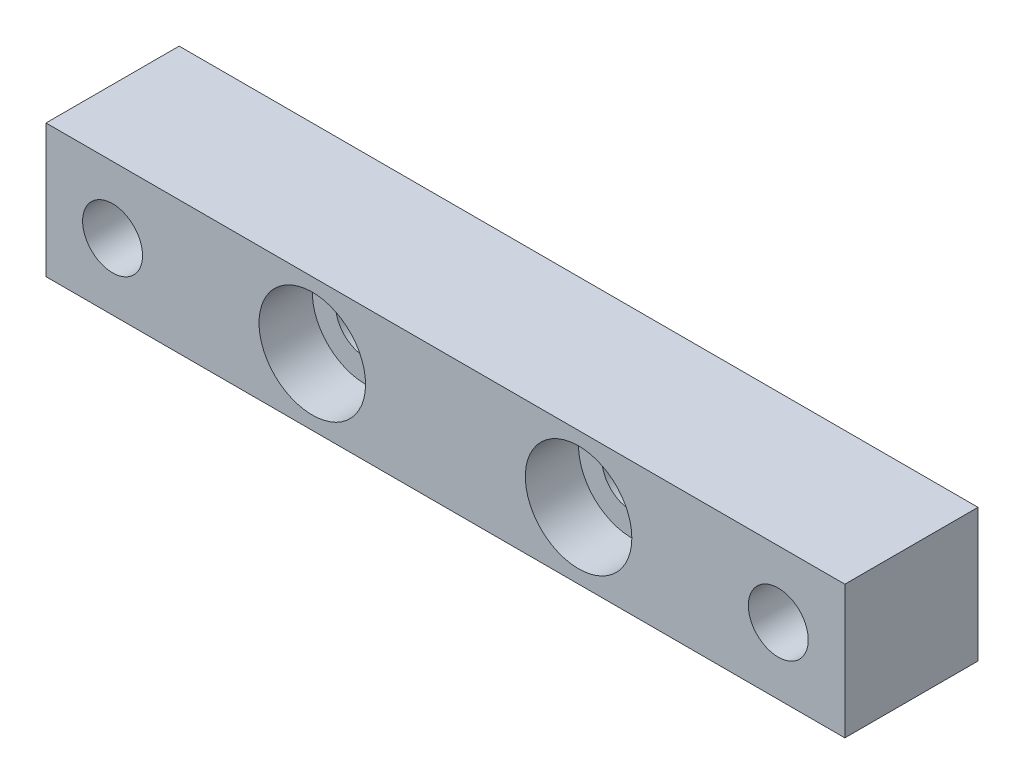
ISO-10303-21;
HEADER;
FILE_DESCRIPTION(('STEP AP214'),'2;1');
FILE_NAME('part.step','',(''),(''),'','','');
FILE_SCHEMA(('AUTOMOTIVE_DESIGN { 1 0 10303 214 1 1 1 1 }'));
ENDSEC;
DATA;
#1=APPLICATION_CONTEXT('core data for automotive mechanical design processes');
#2=APPLICATION_PROTOCOL_DEFINITION('international standard','automotive_design',2000,#1);
#3=PRODUCT_CONTEXT('',#1,'mechanical');
#4=PRODUCT('Part','Part','',(#3));
#5=PRODUCT_RELATED_PRODUCT_CATEGORY('part','',(#4));
#6=PRODUCT_DEFINITION_FORMATION('','',#4);
#7=PRODUCT_DEFINITION_CONTEXT('part definition',#1,'design');
#8=PRODUCT_DEFINITION('design','',#6,#7);
#9=PRODUCT_DEFINITION_SHAPE('','',#8);
#10=(LENGTH_UNIT() NAMED_UNIT(*) SI_UNIT(.MILLI.,.METRE.));
#11=(NAMED_UNIT(*) PLANE_ANGLE_UNIT() SI_UNIT($,.RADIAN.));
#12=(NAMED_UNIT(*) SI_UNIT($,.STERADIAN.) SOLID_ANGLE_UNIT());
#13=UNCERTAINTY_MEASURE_WITH_UNIT(LENGTH_MEASURE(1.E-05),#10,'distance_accuracy_value','');
#14=(GEOMETRIC_REPRESENTATION_CONTEXT(3) GLOBAL_UNCERTAINTY_ASSIGNED_CONTEXT((#13)) GLOBAL_UNIT_ASSIGNED_CONTEXT((#10,
#11,#12)) REPRESENTATION_CONTEXT('',''));
#15=CARTESIAN_POINT('',(0.,0.,0.));
#16=DIRECTION('',(0.,0.,1.));
#17=DIRECTION('',(1.,0.,0.));
#18=AXIS2_PLACEMENT_3D('',#15,#16,#17);
#19=CARTESIAN_POINT('',(-10.,0.,5.));
#20=DIRECTION('',(0.,0.,-1.));
#21=DIRECTION('',(-1.,0.,0.));
#22=AXIS2_PLACEMENT_3D('',#19,#20,#21);
#23=CYLINDRICAL_SURFACE('',#22,2.25);
#24=CARTESIAN_POINT('',(-10.,0.,-5.));
#25=DIRECTION('',(0.,0.,1.));
#26=DIRECTION('',(1.,0.,0.));
#27=AXIS2_PLACEMENT_3D('',#24,#25,#26);
#28=CIRCLE('',#27,2.25);
#29=CARTESIAN_POINT('',(-7.75,0.,-5.));
#30=VERTEX_POINT('',#29);
#31=EDGE_CURVE('E110',#30,#30,#28,.T.);
#32=ORIENTED_EDGE('',*,*,#31,.F.);
#33=EDGE_LOOP('',(#32));
#34=FACE_BOUND('',#33,.T.);
#35=CARTESIAN_POINT('',(-10.,0.,1.));
#36=DIRECTION('',(0.,0.,1.));
#37=DIRECTION('',(1.,0.,0.));
#38=AXIS2_PLACEMENT_3D('',#35,#36,#37);
#39=CIRCLE('',#38,2.25);
#40=CARTESIAN_POINT('',(-7.75,0.,1.));
#41=VERTEX_POINT('',#40);
#42=EDGE_CURVE('E43',#41,#41,#39,.T.);
#43=ORIENTED_EDGE('',*,*,#42,.T.);
#44=EDGE_LOOP('',(#43));
#45=FACE_BOUND('',#44,.T.);
#46=ADVANCED_FACE('F39',(#34,#45),#23,.F.);
#47=CARTESIAN_POINT('',(10.,0.,5.));
#48=DIRECTION('',(0.,0.,-1.));
#49=DIRECTION('',(-1.,0.,0.));
#50=AXIS2_PLACEMENT_3D('',#47,#48,#49);
#51=CYLINDRICAL_SURFACE('',#50,2.25);
#52=CARTESIAN_POINT('',(10.,0.,-5.));
#53=DIRECTION('',(0.,0.,1.));
#54=DIRECTION('',(1.,0.,0.));
#55=AXIS2_PLACEMENT_3D('',#52,#53,#54);
#56=CIRCLE('',#55,2.25);
#57=CARTESIAN_POINT('',(12.25,0.,-5.));
#58=VERTEX_POINT('',#57);
#59=EDGE_CURVE('E145',#58,#58,#56,.T.);
#60=ORIENTED_EDGE('',*,*,#59,.F.);
#61=EDGE_LOOP('',(#60));
#62=FACE_BOUND('',#61,.T.);
#63=CARTESIAN_POINT('',(10.,0.,1.));
#64=DIRECTION('',(0.,0.,1.));
#65=DIRECTION('',(1.,0.,0.));
#66=AXIS2_PLACEMENT_3D('',#63,#64,#65);
#67=CIRCLE('',#66,2.25);
#68=CARTESIAN_POINT('',(12.25,0.,1.));
#69=VERTEX_POINT('',#68);
#70=EDGE_CURVE('E115',#69,#69,#67,.T.);
#71=ORIENTED_EDGE('',*,*,#70,.T.);
#72=EDGE_LOOP('',(#71));
#73=FACE_BOUND('',#72,.T.);
#74=ADVANCED_FACE('F158',(#62,#73),#51,.F.);
#75=CARTESIAN_POINT('',(0.,0.,5.));
#76=DIRECTION('',(0.,0.,1.));
#77=DIRECTION('',(1.,0.,0.));
#78=AXIS2_PLACEMENT_3D('',#75,#76,#77);
#79=PLANE('',#78);
#80=CARTESIAN_POINT('',(-10.,0.,5.));
#81=DIRECTION('',(0.,0.,1.));
#82=DIRECTION('',(1.,0.,0.));
#83=AXIS2_PLACEMENT_3D('',#80,#81,#82);
#84=CIRCLE('',#83,4.);
#85=CARTESIAN_POINT('',(-6.,0.,5.));
#86=VERTEX_POINT('',#85);
#87=EDGE_CURVE('E123',#86,#86,#84,.T.);
#88=ORIENTED_EDGE('',*,*,#87,.F.);
#89=EDGE_LOOP('',(#88));
#90=FACE_BOUND('',#89,.T.);
#91=CARTESIAN_POINT('',(10.,0.,5.));
#92=DIRECTION('',(0.,0.,1.));
#93=DIRECTION('',(1.,0.,0.));
#94=AXIS2_PLACEMENT_3D('',#91,#92,#93);
#95=CIRCLE('',#94,4.);
#96=CARTESIAN_POINT('',(14.,0.,5.));
#97=VERTEX_POINT('',#96);
#98=EDGE_CURVE('E128',#97,#97,#95,.T.);
#99=ORIENTED_EDGE('',*,*,#98,.F.);
#100=EDGE_LOOP('',(#99));
#101=FACE_BOUND('',#100,.T.);
#102=CARTESIAN_POINT('',(-25.,0.,5.));
#103=DIRECTION('',(0.,0.,1.));
#104=DIRECTION('',(1.,0.,0.));
#105=AXIS2_PLACEMENT_3D('',#102,#103,#104);
#106=CIRCLE('',#105,2.25);
#107=CARTESIAN_POINT('',(-22.75,0.,5.));
#108=VERTEX_POINT('',#107);
#109=EDGE_CURVE('E142',#108,#108,#106,.T.);
#110=ORIENTED_EDGE('',*,*,#109,.F.);
#111=EDGE_LOOP('',(#110));
#112=FACE_BOUND('',#111,.T.);
#113=DIRECTION('',(0.,-1.,0.));
#114=VECTOR('',#113,1.);
#115=CARTESIAN_POINT('',(-30.,-5.,5.));
#116=LINE('',#115,#114);
#117=CARTESIAN_POINT('',(-30.,5.,5.));
#118=VERTEX_POINT('',#117);
#119=CARTESIAN_POINT('',(-30.,-5.,5.));
#120=VERTEX_POINT('',#119);
#121=EDGE_CURVE('E94',#118,#120,#116,.T.);
#122=ORIENTED_EDGE('',*,*,#121,.T.);
#123=DIRECTION('',(1.,0.,0.));
#124=VECTOR('',#123,1.);
#125=CARTESIAN_POINT('',(30.,-5.,5.));
#126=LINE('',#125,#124);
#127=CARTESIAN_POINT('',(30.,-5.,5.));
#128=VERTEX_POINT('',#127);
#129=EDGE_CURVE('E88',#120,#128,#126,.T.);
#130=ORIENTED_EDGE('',*,*,#129,.T.);
#131=DIRECTION('',(0.,1.,0.));
#132=VECTOR('',#131,1.);
#133=CARTESIAN_POINT('',(30.,-5.,5.));
#134=LINE('',#133,#132);
#135=CARTESIAN_POINT('',(30.,5.,5.));
#136=VERTEX_POINT('',#135);
#137=EDGE_CURVE('E92',#128,#136,#134,.T.);
#138=ORIENTED_EDGE('',*,*,#137,.T.);
#139=DIRECTION('',(-1.,0.,0.));
#140=VECTOR('',#139,1.);
#141=CARTESIAN_POINT('',(30.,5.,5.));
#142=LINE('',#141,#140);
#143=EDGE_CURVE('E58',#136,#118,#142,.T.);
#144=ORIENTED_EDGE('',*,*,#143,.T.);
#145=EDGE_LOOP('',(#122,#130,#138,#144));
#146=FACE_BOUND('',#145,.T.);
#147=CARTESIAN_POINT('',(25.,0.,5.));
#148=DIRECTION('',(0.,0.,1.));
#149=DIRECTION('',(-1.,0.,0.));
#150=AXIS2_PLACEMENT_3D('',#147,#148,#149);
#151=CIRCLE('',#150,2.25);
#152=CARTESIAN_POINT('',(22.75,0.,5.));
#153=VERTEX_POINT('',#152);
#154=EDGE_CURVE('E136',#153,#153,#151,.T.);
#155=ORIENTED_EDGE('',*,*,#154,.F.);
#156=EDGE_LOOP('',(#155));
#157=FACE_BOUND('',#156,.T.);
#158=ADVANCED_FACE('F89',(#90,#101,#112,#146,#157),#79,.T.);
#159=CARTESIAN_POINT('',(0.,0.,-5.));
#160=DIRECTION('',(0.,0.,1.));
#161=DIRECTION('',(1.,0.,0.));
#162=AXIS2_PLACEMENT_3D('',#159,#160,#161);
#163=PLANE('',#162);
#164=DIRECTION('',(0.,-1.,0.));
#165=VECTOR('',#164,1.);
#166=CARTESIAN_POINT('',(-30.,-5.,-5.));
#167=LINE('',#166,#165);
#168=CARTESIAN_POINT('',(-30.,5.,-5.));
#169=VERTEX_POINT('',#168);
#170=CARTESIAN_POINT('',(-30.,-5.,-5.));
#171=VERTEX_POINT('',#170);
#172=EDGE_CURVE('E107',#169,#171,#167,.T.);
#173=ORIENTED_EDGE('',*,*,#172,.F.);
#174=DIRECTION('',(-1.,0.,0.));
#175=VECTOR('',#174,1.);
#176=CARTESIAN_POINT('',(30.,5.,-5.));
#177=LINE('',#176,#175);
#178=CARTESIAN_POINT('',(30.,5.,-5.));
#179=VERTEX_POINT('',#178);
#180=EDGE_CURVE('E81',#179,#169,#177,.T.);
#181=ORIENTED_EDGE('',*,*,#180,.F.);
#182=DIRECTION('',(0.,1.,0.));
#183=VECTOR('',#182,1.);
#184=CARTESIAN_POINT('',(30.,-5.,-5.));
#185=LINE('',#184,#183);
#186=CARTESIAN_POINT('',(30.,-5.,-5.));
#187=VERTEX_POINT('',#186);
#188=EDGE_CURVE('E75',#187,#179,#185,.T.);
#189=ORIENTED_EDGE('',*,*,#188,.F.);
#190=DIRECTION('',(1.,0.,0.));
#191=VECTOR('',#190,1.);
#192=CARTESIAN_POINT('',(30.,-5.,-5.));
#193=LINE('',#192,#191);
#194=EDGE_CURVE('E98',#171,#187,#193,.T.);
#195=ORIENTED_EDGE('',*,*,#194,.F.);
#196=EDGE_LOOP('',(#173,#181,#189,#195));
#197=FACE_BOUND('',#196,.T.);
#198=ORIENTED_EDGE('',*,*,#31,.T.);
#199=EDGE_LOOP('',(#198));
#200=FACE_BOUND('',#199,.T.);
#201=ORIENTED_EDGE('',*,*,#59,.T.);
#202=EDGE_LOOP('',(#201));
#203=FACE_BOUND('',#202,.T.);
#204=CARTESIAN_POINT('',(-25.,0.,-5.));
#205=DIRECTION('',(0.,0.,1.));
#206=DIRECTION('',(1.,0.,0.));
#207=AXIS2_PLACEMENT_3D('',#204,#205,#206);
#208=CIRCLE('',#207,2.25);
#209=CARTESIAN_POINT('',(-22.75,0.,-5.));
#210=VERTEX_POINT('',#209);
#211=EDGE_CURVE('E139',#210,#210,#208,.T.);
#212=ORIENTED_EDGE('',*,*,#211,.T.);
#213=EDGE_LOOP('',(#212));
#214=FACE_BOUND('',#213,.T.);
#215=CARTESIAN_POINT('',(25.,0.,-5.));
#216=DIRECTION('',(0.,0.,1.));
#217=DIRECTION('',(-1.,0.,0.));
#218=AXIS2_PLACEMENT_3D('',#215,#216,#217);
#219=CIRCLE('',#218,2.25);
#220=CARTESIAN_POINT('',(22.75,0.,-5.));
#221=VERTEX_POINT('',#220);
#222=EDGE_CURVE('E121',#221,#221,#219,.T.);
#223=ORIENTED_EDGE('',*,*,#222,.T.);
#224=EDGE_LOOP('',(#223));
#225=FACE_BOUND('',#224,.T.);
#226=ADVANCED_FACE('F153',(#197,#200,#203,#214,#225),#163,.F.);
#227=CARTESIAN_POINT('',(-30.,-5.,5.));
#228=DIRECTION('',(1.,0.,0.));
#229=DIRECTION('',(0.,0.,-1.));
#230=AXIS2_PLACEMENT_3D('',#227,#228,#229);
#231=PLANE('',#230);
#232=ORIENTED_EDGE('',*,*,#172,.T.);
#233=DIRECTION('',(0.,0.,-1.));
#234=VECTOR('',#233,1.);
#235=CARTESIAN_POINT('',(-30.,-5.,5.));
#236=LINE('',#235,#234);
#237=EDGE_CURVE('E11',#120,#171,#236,.T.);
#238=ORIENTED_EDGE('',*,*,#237,.F.);
#239=ORIENTED_EDGE('',*,*,#121,.F.);
#240=DIRECTION('',(0.,0.,-1.));
#241=VECTOR('',#240,1.);
#242=CARTESIAN_POINT('',(-30.,5.,5.));
#243=LINE('',#242,#241);
#244=EDGE_CURVE('E103',#118,#169,#243,.T.);
#245=ORIENTED_EDGE('',*,*,#244,.T.);
#246=EDGE_LOOP('',(#232,#238,#239,#245));
#247=FACE_BOUND('',#246,.T.);
#248=ADVANCED_FACE('F41',(#247),#231,.F.);
#249=CARTESIAN_POINT('',(30.,-5.,5.));
#250=DIRECTION('',(0.,1.,0.));
#251=DIRECTION('',(0.,0.,1.));
#252=AXIS2_PLACEMENT_3D('',#249,#250,#251);
#253=PLANE('',#252);
#254=ORIENTED_EDGE('',*,*,#194,.T.);
#255=DIRECTION('',(0.,0.,-1.));
#256=VECTOR('',#255,1.);
#257=CARTESIAN_POINT('',(30.,-5.,5.));
#258=LINE('',#257,#256);
#259=EDGE_CURVE('E49',#128,#187,#258,.T.);
#260=ORIENTED_EDGE('',*,*,#259,.F.);
#261=ORIENTED_EDGE('',*,*,#129,.F.);
#262=ORIENTED_EDGE('',*,*,#237,.T.);
#263=EDGE_LOOP('',(#254,#260,#261,#262));
#264=FACE_BOUND('',#263,.T.);
#265=ADVANCED_FACE('F97',(#264),#253,.F.);
#266=CARTESIAN_POINT('',(30.,-5.,5.));
#267=DIRECTION('',(-1.,0.,0.));
#268=DIRECTION('',(0.,0.,1.));
#269=AXIS2_PLACEMENT_3D('',#266,#267,#268);
#270=PLANE('',#269);
#271=ORIENTED_EDGE('',*,*,#188,.T.);
#272=DIRECTION('',(0.,0.,-1.));
#273=VECTOR('',#272,1.);
#274=CARTESIAN_POINT('',(30.,5.,5.));
#275=LINE('',#274,#273);
#276=EDGE_CURVE('E99',#136,#179,#275,.T.);
#277=ORIENTED_EDGE('',*,*,#276,.F.);
#278=ORIENTED_EDGE('',*,*,#137,.F.);
#279=ORIENTED_EDGE('',*,*,#259,.T.);
#280=EDGE_LOOP('',(#271,#277,#278,#279));
#281=FACE_BOUND('',#280,.T.);
#282=ADVANCED_FACE('F101',(#281),#270,.F.);
#283=CARTESIAN_POINT('',(30.,5.,5.));
#284=DIRECTION('',(0.,-1.,0.));
#285=DIRECTION('',(0.,0.,-1.));
#286=AXIS2_PLACEMENT_3D('',#283,#284,#285);
#287=PLANE('',#286);
#288=ORIENTED_EDGE('',*,*,#180,.T.);
#289=ORIENTED_EDGE('',*,*,#244,.F.);
#290=ORIENTED_EDGE('',*,*,#143,.F.);
#291=ORIENTED_EDGE('',*,*,#276,.T.);
#292=EDGE_LOOP('',(#288,#289,#290,#291));
#293=FACE_BOUND('',#292,.T.);
#294=ADVANCED_FACE('F187',(#293),#287,.F.);
#295=CARTESIAN_POINT('',(-25.,0.,5.));
#296=DIRECTION('',(0.,0.,-1.));
#297=DIRECTION('',(-1.,0.,0.));
#298=AXIS2_PLACEMENT_3D('',#295,#296,#297);
#299=CYLINDRICAL_SURFACE('',#298,2.25);
#300=ORIENTED_EDGE('',*,*,#109,.T.);
#301=EDGE_LOOP('',(#300));
#302=FACE_BOUND('',#301,.T.);
#303=ORIENTED_EDGE('',*,*,#211,.F.);
#304=EDGE_LOOP('',(#303));
#305=FACE_BOUND('',#304,.T.);
#306=ADVANCED_FACE('F183',(#302,#305),#299,.F.);
#307=CARTESIAN_POINT('',(25.,0.,5.));
#308=DIRECTION('',(0.,0.,-1.));
#309=DIRECTION('',(-1.,0.,0.));
#310=AXIS2_PLACEMENT_3D('',#307,#308,#309);
#311=CYLINDRICAL_SURFACE('',#310,2.25);
#312=ORIENTED_EDGE('',*,*,#154,.T.);
#313=EDGE_LOOP('',(#312));
#314=FACE_BOUND('',#313,.T.);
#315=ORIENTED_EDGE('',*,*,#222,.F.);
#316=EDGE_LOOP('',(#315));
#317=FACE_BOUND('',#316,.T.);
#318=ADVANCED_FACE('F176',(#314,#317),#311,.F.);
#319=CARTESIAN_POINT('',(10.,0.,1.));
#320=DIRECTION('',(0.,0.,1.));
#321=DIRECTION('',(1.,0.,0.));
#322=AXIS2_PLACEMENT_3D('',#319,#320,#321);
#323=CYLINDRICAL_SURFACE('',#322,4.);
#324=CARTESIAN_POINT('',(10.,0.,1.));
#325=DIRECTION('',(0.,0.,1.));
#326=DIRECTION('',(1.,0.,0.));
#327=AXIS2_PLACEMENT_3D('',#324,#325,#326);
#328=CIRCLE('',#327,4.);
#329=CARTESIAN_POINT('',(14.,0.,1.));
#330=VERTEX_POINT('',#329);
#331=EDGE_CURVE('E133',#330,#330,#328,.T.);
#332=ORIENTED_EDGE('',*,*,#331,.F.);
#333=EDGE_LOOP('',(#332));
#334=FACE_BOUND('',#333,.T.);
#335=ORIENTED_EDGE('',*,*,#98,.T.);
#336=EDGE_LOOP('',(#335));
#337=FACE_BOUND('',#336,.T.);
#338=ADVANCED_FACE('F173',(#334,#337),#323,.F.);
#339=CARTESIAN_POINT('',(10.,0.,1.));
#340=DIRECTION('',(0.,0.,1.));
#341=DIRECTION('',(1.,0.,0.));
#342=AXIS2_PLACEMENT_3D('',#339,#340,#341);
#343=PLANE('',#342);
#344=ORIENTED_EDGE('',*,*,#70,.F.);
#345=EDGE_LOOP('',(#344));
#346=FACE_BOUND('',#345,.T.);
#347=ORIENTED_EDGE('',*,*,#331,.T.);
#348=EDGE_LOOP('',(#347));
#349=FACE_BOUND('',#348,.T.);
#350=ADVANCED_FACE('F169',(#346,#349),#343,.T.);
#351=CARTESIAN_POINT('',(-10.,0.,1.));
#352=DIRECTION('',(0.,0.,1.));
#353=DIRECTION('',(1.,0.,0.));
#354=AXIS2_PLACEMENT_3D('',#351,#352,#353);
#355=CYLINDRICAL_SURFACE('',#354,4.);
#356=CARTESIAN_POINT('',(-10.,0.,1.));
#357=DIRECTION('',(0.,0.,1.));
#358=DIRECTION('',(1.,0.,0.));
#359=AXIS2_PLACEMENT_3D('',#356,#357,#358);
#360=CIRCLE('',#359,4.);
#361=CARTESIAN_POINT('',(-6.,0.,1.));
#362=VERTEX_POINT('',#361);
#363=EDGE_CURVE('E117',#362,#362,#360,.T.);
#364=ORIENTED_EDGE('',*,*,#363,.F.);
#365=EDGE_LOOP('',(#364));
#366=FACE_BOUND('',#365,.T.);
#367=ORIENTED_EDGE('',*,*,#87,.T.);
#368=EDGE_LOOP('',(#367));
#369=FACE_BOUND('',#368,.T.);
#370=ADVANCED_FACE('F164',(#366,#369),#355,.F.);
#371=CARTESIAN_POINT('',(-10.,0.,1.));
#372=DIRECTION('',(0.,0.,1.));
#373=DIRECTION('',(1.,0.,0.));
#374=AXIS2_PLACEMENT_3D('',#371,#372,#373);
#375=PLANE('',#374);
#376=ORIENTED_EDGE('',*,*,#42,.F.);
#377=EDGE_LOOP('',(#376));
#378=FACE_BOUND('',#377,.T.);
#379=ORIENTED_EDGE('',*,*,#363,.T.);
#380=EDGE_LOOP('',(#379));
#381=FACE_BOUND('',#380,.T.);
#382=ADVANCED_FACE('F162',(#378,#381),#375,.T.);
#383=CLOSED_SHELL('',(#46,#74,#158,#226,#248,#265,#282,#294,#306,#318,#338,#350,#370,#382));
#384=MANIFOLD_SOLID_BREP('B2',#383);
#385=ADVANCED_BREP_SHAPE_REPRESENTATION('',(#18,#384),#14);
#386=SHAPE_DEFINITION_REPRESENTATION(#9,#385);
ENDSEC;
END-ISO-10303-21;
